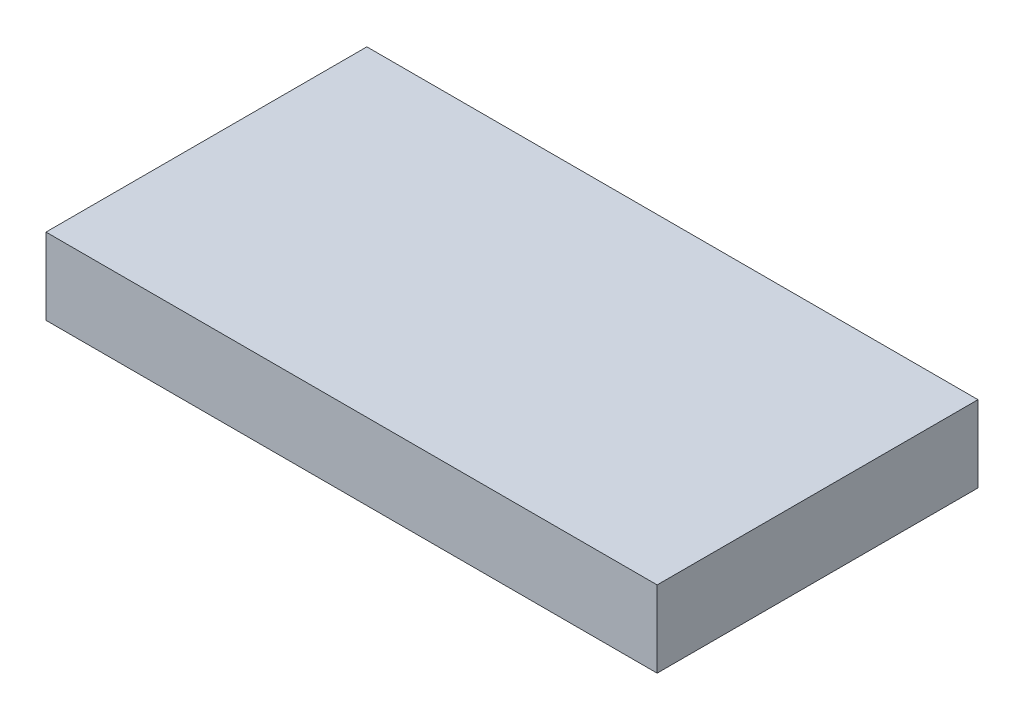
ISO-10303-21;
HEADER;
FILE_DESCRIPTION(('STEP AP214'),'2;1');
FILE_NAME('part.step','',(''),(''),'','','');
FILE_SCHEMA(('AUTOMOTIVE_DESIGN { 1 0 10303 214 1 1 1 1 }'));
ENDSEC;
DATA;
#1=APPLICATION_CONTEXT('core data for automotive mechanical design processes');
#2=APPLICATION_PROTOCOL_DEFINITION('international standard','automotive_design',2000,#1);
#3=PRODUCT_CONTEXT('',#1,'mechanical');
#4=PRODUCT('Part','Part','',(#3));
#5=PRODUCT_RELATED_PRODUCT_CATEGORY('part','',(#4));
#6=PRODUCT_DEFINITION_FORMATION('','',#4);
#7=PRODUCT_DEFINITION_CONTEXT('part definition',#1,'design');
#8=PRODUCT_DEFINITION('design','',#6,#7);
#9=PRODUCT_DEFINITION_SHAPE('','',#8);
#10=(LENGTH_UNIT() NAMED_UNIT(*) SI_UNIT(.MILLI.,.METRE.));
#11=(NAMED_UNIT(*) PLANE_ANGLE_UNIT() SI_UNIT($,.RADIAN.));
#12=(NAMED_UNIT(*) SI_UNIT($,.STERADIAN.) SOLID_ANGLE_UNIT());
#13=UNCERTAINTY_MEASURE_WITH_UNIT(LENGTH_MEASURE(1.E-05),#10,'distance_accuracy_value','');
#14=(GEOMETRIC_REPRESENTATION_CONTEXT(3) GLOBAL_UNCERTAINTY_ASSIGNED_CONTEXT((#13)) GLOBAL_UNIT_ASSIGNED_CONTEXT((#10,
#11,#12)) REPRESENTATION_CONTEXT('',''));
#15=CARTESIAN_POINT('',(0.,0.,0.));
#16=DIRECTION('',(0.,0.,1.));
#17=DIRECTION('',(1.,0.,0.));
#18=AXIS2_PLACEMENT_3D('',#15,#16,#17);
#19=CARTESIAN_POINT('',(0.,12.7,0.));
#20=DIRECTION('',(1.,0.,0.));
#21=DIRECTION('',(0.,0.,-1.));
#22=AXIS2_PLACEMENT_3D('',#19,#20,#21);
#23=PLANE('',#22);
#24=DIRECTION('',(0.,0.,1.));
#25=VECTOR('',#24,1.);
#26=CARTESIAN_POINT('',(0.,0.,0.));
#27=LINE('',#26,#25);
#28=CARTESIAN_POINT('',(0.,0.,-53.3));
#29=VERTEX_POINT('',#28);
#30=CARTESIAN_POINT('',(0.,0.,0.));
#31=VERTEX_POINT('',#30);
#32=EDGE_CURVE('E96',#29,#31,#27,.T.);
#33=ORIENTED_EDGE('',*,*,#32,.T.);
#34=DIRECTION('',(0.,-1.,0.));
#35=VECTOR('',#34,1.);
#36=CARTESIAN_POINT('',(0.,12.7,0.));
#37=LINE('',#36,#35);
#38=CARTESIAN_POINT('',(0.,12.7,0.));
#39=VERTEX_POINT('',#38);
#40=EDGE_CURVE('E11',#39,#31,#37,.T.);
#41=ORIENTED_EDGE('',*,*,#40,.F.);
#42=DIRECTION('',(0.,0.,1.));
#43=VECTOR('',#42,1.);
#44=CARTESIAN_POINT('',(0.,12.7,0.));
#45=LINE('',#44,#43);
#46=CARTESIAN_POINT('',(0.,12.7,-53.3));
#47=VERTEX_POINT('',#46);
#48=EDGE_CURVE('E84',#47,#39,#45,.T.);
#49=ORIENTED_EDGE('',*,*,#48,.F.);
#50=DIRECTION('',(0.,-1.,0.));
#51=VECTOR('',#50,1.);
#52=CARTESIAN_POINT('',(0.,12.7,-53.3));
#53=LINE('',#52,#51);
#54=EDGE_CURVE('E92',#47,#29,#53,.T.);
#55=ORIENTED_EDGE('',*,*,#54,.T.);
#56=EDGE_LOOP('',(#33,#41,#49,#55));
#57=FACE_BOUND('',#56,.T.);
#58=ADVANCED_FACE('F33',(#57),#23,.F.);
#59=CARTESIAN_POINT('',(0.,12.7,0.));
#60=DIRECTION('',(0.,0.,-1.));
#61=DIRECTION('',(-1.,0.,0.));
#62=AXIS2_PLACEMENT_3D('',#59,#60,#61);
#63=PLANE('',#62);
#64=DIRECTION('',(1.,0.,0.));
#65=VECTOR('',#64,1.);
#66=CARTESIAN_POINT('',(0.,0.,0.));
#67=LINE('',#66,#65);
#68=CARTESIAN_POINT('',(101.52,0.,0.));
#69=VERTEX_POINT('',#68);
#70=EDGE_CURVE('E88',#31,#69,#67,.T.);
#71=ORIENTED_EDGE('',*,*,#70,.T.);
#72=DIRECTION('',(0.,-1.,0.));
#73=VECTOR('',#72,1.);
#74=CARTESIAN_POINT('',(101.52,12.7,0.));
#75=LINE('',#74,#73);
#76=CARTESIAN_POINT('',(101.52,12.7,0.));
#77=VERTEX_POINT('',#76);
#78=EDGE_CURVE('E41',#77,#69,#75,.T.);
#79=ORIENTED_EDGE('',*,*,#78,.F.);
#80=DIRECTION('',(1.,0.,0.));
#81=VECTOR('',#80,1.);
#82=CARTESIAN_POINT('',(0.,12.7,0.));
#83=LINE('',#82,#81);
#84=EDGE_CURVE('E79',#39,#77,#83,.T.);
#85=ORIENTED_EDGE('',*,*,#84,.F.);
#86=ORIENTED_EDGE('',*,*,#40,.T.);
#87=EDGE_LOOP('',(#71,#79,#85,#86));
#88=FACE_BOUND('',#87,.T.);
#89=ADVANCED_FACE('F87',(#88),#63,.F.);
#90=CARTESIAN_POINT('',(101.52,12.7,0.));
#91=DIRECTION('',(-1.,0.,0.));
#92=DIRECTION('',(0.,0.,1.));
#93=AXIS2_PLACEMENT_3D('',#90,#91,#92);
#94=PLANE('',#93);
#95=DIRECTION('',(0.,0.,-1.));
#96=VECTOR('',#95,1.);
#97=CARTESIAN_POINT('',(101.52,0.,0.));
#98=LINE('',#97,#96);
#99=CARTESIAN_POINT('',(101.52,0.,-53.3));
#100=VERTEX_POINT('',#99);
#101=EDGE_CURVE('E66',#69,#100,#98,.T.);
#102=ORIENTED_EDGE('',*,*,#101,.T.);
#103=DIRECTION('',(0.,-1.,0.));
#104=VECTOR('',#103,1.);
#105=CARTESIAN_POINT('',(101.52,12.7,-53.3));
#106=LINE('',#105,#104);
#107=CARTESIAN_POINT('',(101.52,12.7,-53.3));
#108=VERTEX_POINT('',#107);
#109=EDGE_CURVE('E89',#108,#100,#106,.T.);
#110=ORIENTED_EDGE('',*,*,#109,.F.);
#111=DIRECTION('',(0.,0.,-1.));
#112=VECTOR('',#111,1.);
#113=CARTESIAN_POINT('',(101.52,12.7,0.));
#114=LINE('',#113,#112);
#115=EDGE_CURVE('E82',#77,#108,#114,.T.);
#116=ORIENTED_EDGE('',*,*,#115,.F.);
#117=ORIENTED_EDGE('',*,*,#78,.T.);
#118=EDGE_LOOP('',(#102,#110,#116,#117));
#119=FACE_BOUND('',#118,.T.);
#120=ADVANCED_FACE('F90',(#119),#94,.F.);
#121=CARTESIAN_POINT('',(0.,12.7,-53.3));
#122=DIRECTION('',(0.,0.,1.));
#123=DIRECTION('',(1.,0.,0.));
#124=AXIS2_PLACEMENT_3D('',#121,#122,#123);
#125=PLANE('',#124);
#126=DIRECTION('',(-1.,0.,0.));
#127=VECTOR('',#126,1.);
#128=CARTESIAN_POINT('',(0.,0.,-53.3));
#129=LINE('',#128,#127);
#130=EDGE_CURVE('E72',#100,#29,#129,.T.);
#131=ORIENTED_EDGE('',*,*,#130,.T.);
#132=ORIENTED_EDGE('',*,*,#54,.F.);
#133=DIRECTION('',(-1.,0.,0.));
#134=VECTOR('',#133,1.);
#135=CARTESIAN_POINT('',(0.,12.7,-53.3));
#136=LINE('',#135,#134);
#137=EDGE_CURVE('E49',#108,#47,#136,.T.);
#138=ORIENTED_EDGE('',*,*,#137,.F.);
#139=ORIENTED_EDGE('',*,*,#109,.T.);
#140=EDGE_LOOP('',(#131,#132,#138,#139));
#141=FACE_BOUND('',#140,.T.);
#142=ADVANCED_FACE('F103',(#141),#125,.F.);
#143=CARTESIAN_POINT('',(0.,12.7,0.));
#144=DIRECTION('',(0.,-1.,0.));
#145=DIRECTION('',(0.,0.,-1.));
#146=AXIS2_PLACEMENT_3D('',#143,#144,#145);
#147=PLANE('',#146);
#148=ORIENTED_EDGE('',*,*,#48,.T.);
#149=ORIENTED_EDGE('',*,*,#84,.T.);
#150=ORIENTED_EDGE('',*,*,#115,.T.);
#151=ORIENTED_EDGE('',*,*,#137,.T.);
#152=EDGE_LOOP('',(#148,#149,#150,#151));
#153=FACE_BOUND('',#152,.T.);
#154=ADVANCED_FACE('F80',(#153),#147,.F.);
#155=CARTESIAN_POINT('',(0.,0.,0.));
#156=DIRECTION('',(0.,-1.,0.));
#157=DIRECTION('',(0.,0.,-1.));
#158=AXIS2_PLACEMENT_3D('',#155,#156,#157);
#159=PLANE('',#158);
#160=ORIENTED_EDGE('',*,*,#32,.F.);
#161=ORIENTED_EDGE('',*,*,#130,.F.);
#162=ORIENTED_EDGE('',*,*,#101,.F.);
#163=ORIENTED_EDGE('',*,*,#70,.F.);
#164=EDGE_LOOP('',(#160,#161,#162,#163));
#165=FACE_BOUND('',#164,.T.);
#166=ADVANCED_FACE('F106',(#165),#159,.T.);
#167=CLOSED_SHELL('',(#58,#89,#120,#142,#154,#166));
#168=MANIFOLD_SOLID_BREP('B2',#167);
#169=ADVANCED_BREP_SHAPE_REPRESENTATION('',(#18,#168),#14);
#170=SHAPE_DEFINITION_REPRESENTATION(#9,#169);
ENDSEC;
END-ISO-10303-21;
